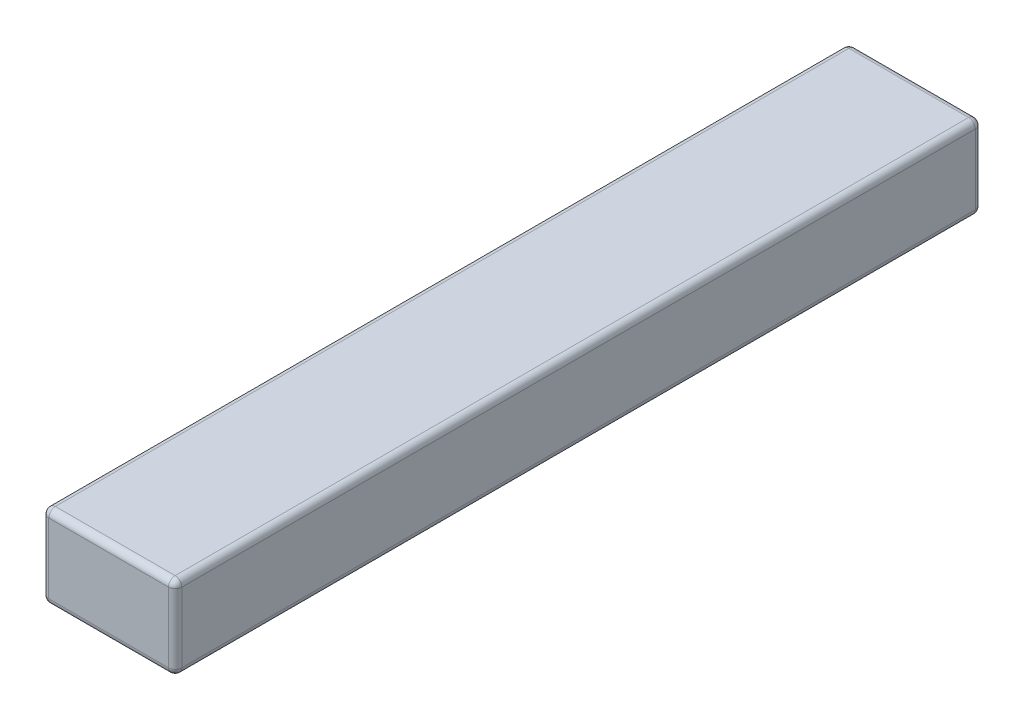
ISO-10303-21;
HEADER;
FILE_DESCRIPTION(('STEP AP214'),'2;1');
FILE_NAME('part.step','',(''),(''),'','','');
FILE_SCHEMA(('AUTOMOTIVE_DESIGN { 1 0 10303 214 1 1 1 1 }'));
ENDSEC;
DATA;
#1=APPLICATION_CONTEXT('core data for automotive mechanical design processes');
#2=APPLICATION_PROTOCOL_DEFINITION('international standard','automotive_design',2000,#1);
#3=PRODUCT_CONTEXT('',#1,'mechanical');
#4=PRODUCT('Part','Part','',(#3));
#5=PRODUCT_RELATED_PRODUCT_CATEGORY('part','',(#4));
#6=PRODUCT_DEFINITION_FORMATION('','',#4);
#7=PRODUCT_DEFINITION_CONTEXT('part definition',#1,'design');
#8=PRODUCT_DEFINITION('design','',#6,#7);
#9=PRODUCT_DEFINITION_SHAPE('','',#8);
#10=(LENGTH_UNIT() NAMED_UNIT(*) SI_UNIT(.MILLI.,.METRE.));
#11=(NAMED_UNIT(*) PLANE_ANGLE_UNIT() SI_UNIT($,.RADIAN.));
#12=(NAMED_UNIT(*) SI_UNIT($,.STERADIAN.) SOLID_ANGLE_UNIT());
#13=UNCERTAINTY_MEASURE_WITH_UNIT(LENGTH_MEASURE(1.E-05),#10,'distance_accuracy_value','');
#14=(GEOMETRIC_REPRESENTATION_CONTEXT(3) GLOBAL_UNCERTAINTY_ASSIGNED_CONTEXT((#13)) GLOBAL_UNIT_ASSIGNED_CONTEXT((#10,
#11,#12)) REPRESENTATION_CONTEXT('',''));
#15=CARTESIAN_POINT('',(0.,0.,0.));
#16=DIRECTION('',(0.,0.,1.));
#17=DIRECTION('',(1.,0.,0.));
#18=AXIS2_PLACEMENT_3D('',#15,#16,#17);
#19=CARTESIAN_POINT('',(0.,0.,485.));
#20=DIRECTION('',(1.,0.,0.));
#21=DIRECTION('',(0.,0.,-1.));
#22=AXIS2_PLACEMENT_3D('',#19,#20,#21);
#23=PLANE('',#22);
#24=DIRECTION('',(0.,-1.,0.));
#25=VECTOR('',#24,1.);
#26=CARTESIAN_POINT('',(0.,0.,4.));
#27=LINE('',#26,#25);
#28=CARTESIAN_POINT('',(0.,-4.,4.));
#29=VERTEX_POINT('',#28);
#30=CARTESIAN_POINT('',(0.,-46.,4.));
#31=VERTEX_POINT('',#30);
#32=EDGE_CURVE('E171',#29,#31,#27,.T.);
#33=ORIENTED_EDGE('',*,*,#32,.T.);
#34=DIRECTION('',(0.,0.,-1.));
#35=VECTOR('',#34,1.);
#36=CARTESIAN_POINT('',(0.,-46.,485.));
#37=LINE('',#36,#35);
#38=CARTESIAN_POINT('',(0.,-46.,481.));
#39=VERTEX_POINT('',#38);
#40=EDGE_CURVE('E176',#31,#39,#37,.F.);
#41=ORIENTED_EDGE('',*,*,#40,.T.);
#42=DIRECTION('',(0.,-1.,0.));
#43=VECTOR('',#42,1.);
#44=CARTESIAN_POINT('',(0.,0.,481.));
#45=LINE('',#44,#43);
#46=CARTESIAN_POINT('',(0.,-4.,481.));
#47=VERTEX_POINT('',#46);
#48=EDGE_CURVE('E173',#39,#47,#45,.F.);
#49=ORIENTED_EDGE('',*,*,#48,.T.);
#50=DIRECTION('',(0.,0.,-1.));
#51=VECTOR('',#50,1.);
#52=CARTESIAN_POINT('',(0.,-4.,485.));
#53=LINE('',#52,#51);
#54=EDGE_CURVE('E169',#47,#29,#53,.T.);
#55=ORIENTED_EDGE('',*,*,#54,.T.);
#56=EDGE_LOOP('',(#33,#41,#49,#55));
#57=FACE_BOUND('',#56,.T.);
#58=ADVANCED_FACE('F39',(#57),#23,.F.);
#59=CARTESIAN_POINT('',(0.,-50.,485.));
#60=DIRECTION('',(0.,1.,0.));
#61=DIRECTION('',(0.,0.,1.));
#62=AXIS2_PLACEMENT_3D('',#59,#60,#61);
#63=PLANE('',#62);
#64=DIRECTION('',(1.,0.,0.));
#65=VECTOR('',#64,1.);
#66=CARTESIAN_POINT('',(0.,-50.,481.));
#67=LINE('',#66,#65);
#68=CARTESIAN_POINT('',(76.,-50.,481.));
#69=VERTEX_POINT('',#68);
#70=CARTESIAN_POINT('',(4.,-50.,481.));
#71=VERTEX_POINT('',#70);
#72=EDGE_CURVE('E191',#69,#71,#67,.F.);
#73=ORIENTED_EDGE('',*,*,#72,.T.);
#74=DIRECTION('',(0.,0.,-1.));
#75=VECTOR('',#74,1.);
#76=CARTESIAN_POINT('',(4.,-50.,485.));
#77=LINE('',#76,#75);
#78=CARTESIAN_POINT('',(4.,-50.,4.));
#79=VERTEX_POINT('',#78);
#80=EDGE_CURVE('E193',#71,#79,#77,.T.);
#81=ORIENTED_EDGE('',*,*,#80,.T.);
#82=DIRECTION('',(1.,0.,0.));
#83=VECTOR('',#82,1.);
#84=CARTESIAN_POINT('',(0.,-50.,4.));
#85=LINE('',#84,#83);
#86=CARTESIAN_POINT('',(76.,-50.,4.));
#87=VERTEX_POINT('',#86);
#88=EDGE_CURVE('E189',#79,#87,#85,.T.);
#89=ORIENTED_EDGE('',*,*,#88,.T.);
#90=DIRECTION('',(0.,0.,-1.));
#91=VECTOR('',#90,1.);
#92=CARTESIAN_POINT('',(76.,-50.,485.));
#93=LINE('',#92,#91);
#94=EDGE_CURVE('E187',#87,#69,#93,.F.);
#95=ORIENTED_EDGE('',*,*,#94,.T.);
#96=EDGE_LOOP('',(#73,#81,#89,#95));
#97=FACE_BOUND('',#96,.T.);
#98=ADVANCED_FACE('F282',(#97),#63,.F.);
#99=CARTESIAN_POINT('',(80.,0.,485.));
#100=DIRECTION('',(-1.,0.,0.));
#101=DIRECTION('',(0.,0.,1.));
#102=AXIS2_PLACEMENT_3D('',#99,#100,#101);
#103=PLANE('',#102);
#104=DIRECTION('',(0.,1.,0.));
#105=VECTOR('',#104,1.);
#106=CARTESIAN_POINT('',(80.,-50.,481.));
#107=LINE('',#106,#105);
#108=CARTESIAN_POINT('',(80.,-4.,481.));
#109=VERTEX_POINT('',#108);
#110=CARTESIAN_POINT('',(80.,-46.,481.));
#111=VERTEX_POINT('',#110);
#112=EDGE_CURVE('E144',#109,#111,#107,.F.);
#113=ORIENTED_EDGE('',*,*,#112,.T.);
#114=DIRECTION('',(0.,0.,-1.));
#115=VECTOR('',#114,1.);
#116=CARTESIAN_POINT('',(80.,-46.,485.));
#117=LINE('',#116,#115);
#118=CARTESIAN_POINT('',(80.,-46.,4.));
#119=VERTEX_POINT('',#118);
#120=EDGE_CURVE('E201',#111,#119,#117,.T.);
#121=ORIENTED_EDGE('',*,*,#120,.T.);
#122=DIRECTION('',(0.,1.,0.));
#123=VECTOR('',#122,1.);
#124=CARTESIAN_POINT('',(80.,0.,4.));
#125=LINE('',#124,#123);
#126=CARTESIAN_POINT('',(80.,-4.,4.));
#127=VERTEX_POINT('',#126);
#128=EDGE_CURVE('E198',#119,#127,#125,.T.);
#129=ORIENTED_EDGE('',*,*,#128,.T.);
#130=DIRECTION('',(0.,0.,-1.));
#131=VECTOR('',#130,1.);
#132=CARTESIAN_POINT('',(80.,-4.,485.));
#133=LINE('',#132,#131);
#134=EDGE_CURVE('E196',#127,#109,#133,.F.);
#135=ORIENTED_EDGE('',*,*,#134,.T.);
#136=EDGE_LOOP('',(#113,#121,#129,#135));
#137=FACE_BOUND('',#136,.T.);
#138=ADVANCED_FACE('F269',(#137),#103,.F.);
#139=CARTESIAN_POINT('',(0.,0.,485.));
#140=DIRECTION('',(0.,-1.,0.));
#141=DIRECTION('',(0.,0.,-1.));
#142=AXIS2_PLACEMENT_3D('',#139,#140,#141);
#143=PLANE('',#142);
#144=DIRECTION('',(-1.,0.,0.));
#145=VECTOR('',#144,1.);
#146=CARTESIAN_POINT('',(80.,0.,481.));
#147=LINE('',#146,#145);
#148=CARTESIAN_POINT('',(4.,0.,481.));
#149=VERTEX_POINT('',#148);
#150=CARTESIAN_POINT('',(76.,0.,481.));
#151=VERTEX_POINT('',#150);
#152=EDGE_CURVE('E48',#149,#151,#147,.F.);
#153=ORIENTED_EDGE('',*,*,#152,.T.);
#154=DIRECTION('',(0.,0.,-1.));
#155=VECTOR('',#154,1.);
#156=CARTESIAN_POINT('',(76.,0.,485.));
#157=LINE('',#156,#155);
#158=CARTESIAN_POINT('',(76.,0.,4.));
#159=VERTEX_POINT('',#158);
#160=EDGE_CURVE('E11',#151,#159,#157,.T.);
#161=ORIENTED_EDGE('',*,*,#160,.T.);
#162=DIRECTION('',(-1.,0.,0.));
#163=VECTOR('',#162,1.);
#164=CARTESIAN_POINT('',(0.,0.,4.));
#165=LINE('',#164,#163);
#166=CARTESIAN_POINT('',(4.,0.,4.));
#167=VERTEX_POINT('',#166);
#168=EDGE_CURVE('E204',#159,#167,#165,.T.);
#169=ORIENTED_EDGE('',*,*,#168,.T.);
#170=DIRECTION('',(0.,0.,-1.));
#171=VECTOR('',#170,1.);
#172=CARTESIAN_POINT('',(4.,0.,485.));
#173=LINE('',#172,#171);
#174=EDGE_CURVE('E59',#167,#149,#173,.F.);
#175=ORIENTED_EDGE('',*,*,#174,.T.);
#176=EDGE_LOOP('',(#153,#161,#169,#175));
#177=FACE_BOUND('',#176,.T.);
#178=ADVANCED_FACE('F315',(#177),#143,.F.);
#179=CARTESIAN_POINT('',(0.,0.,485.));
#180=DIRECTION('',(0.,0.,1.));
#181=DIRECTION('',(1.,0.,0.));
#182=AXIS2_PLACEMENT_3D('',#179,#180,#181);
#183=PLANE('',#182);
#184=DIRECTION('',(-1.,0.,0.));
#185=VECTOR('',#184,1.);
#186=CARTESIAN_POINT('',(0.,-4.,485.));
#187=LINE('',#186,#185);
#188=CARTESIAN_POINT('',(76.,-4.,485.));
#189=VERTEX_POINT('',#188);
#190=CARTESIAN_POINT('',(4.,-4.,485.));
#191=VERTEX_POINT('',#190);
#192=EDGE_CURVE('E131',#189,#191,#187,.T.);
#193=ORIENTED_EDGE('',*,*,#192,.T.);
#194=DIRECTION('',(0.,-1.,0.));
#195=VECTOR('',#194,1.);
#196=CARTESIAN_POINT('',(4.,-50.,485.));
#197=LINE('',#196,#195);
#198=CARTESIAN_POINT('',(4.,-46.,485.));
#199=VERTEX_POINT('',#198);
#200=EDGE_CURVE('E167',#191,#199,#197,.T.);
#201=ORIENTED_EDGE('',*,*,#200,.T.);
#202=DIRECTION('',(1.,0.,0.));
#203=VECTOR('',#202,1.);
#204=CARTESIAN_POINT('',(80.,-46.,485.));
#205=LINE('',#204,#203);
#206=CARTESIAN_POINT('',(76.,-46.,485.));
#207=VERTEX_POINT('',#206);
#208=EDGE_CURVE('E134',#199,#207,#205,.T.);
#209=ORIENTED_EDGE('',*,*,#208,.T.);
#210=DIRECTION('',(0.,1.,0.));
#211=VECTOR('',#210,1.);
#212=CARTESIAN_POINT('',(76.,0.,485.));
#213=LINE('',#212,#211);
#214=EDGE_CURVE('E126',#207,#189,#213,.T.);
#215=ORIENTED_EDGE('',*,*,#214,.T.);
#216=EDGE_LOOP('',(#193,#201,#209,#215));
#217=FACE_BOUND('',#216,.T.);
#218=ADVANCED_FACE('F128',(#217),#183,.T.);
#219=CARTESIAN_POINT('',(0.,0.,0.));
#220=DIRECTION('',(0.,0.,1.));
#221=DIRECTION('',(1.,0.,0.));
#222=AXIS2_PLACEMENT_3D('',#219,#220,#221);
#223=PLANE('',#222);
#224=DIRECTION('',(1.,0.,0.));
#225=VECTOR('',#224,1.);
#226=CARTESIAN_POINT('',(0.,-46.,0.));
#227=LINE('',#226,#225);
#228=CARTESIAN_POINT('',(76.,-46.,0.));
#229=VERTEX_POINT('',#228);
#230=CARTESIAN_POINT('',(4.,-46.,0.));
#231=VERTEX_POINT('',#230);
#232=EDGE_CURVE('E182',#229,#231,#227,.F.);
#233=ORIENTED_EDGE('',*,*,#232,.T.);
#234=DIRECTION('',(0.,-1.,0.));
#235=VECTOR('',#234,1.);
#236=CARTESIAN_POINT('',(4.,0.,0.));
#237=LINE('',#236,#235);
#238=CARTESIAN_POINT('',(4.,-4.,0.));
#239=VERTEX_POINT('',#238);
#240=EDGE_CURVE('E184',#231,#239,#237,.F.);
#241=ORIENTED_EDGE('',*,*,#240,.T.);
#242=DIRECTION('',(-1.,0.,0.));
#243=VECTOR('',#242,1.);
#244=CARTESIAN_POINT('',(0.,-4.,0.));
#245=LINE('',#244,#243);
#246=CARTESIAN_POINT('',(76.,-4.,0.));
#247=VERTEX_POINT('',#246);
#248=EDGE_CURVE('E178',#239,#247,#245,.F.);
#249=ORIENTED_EDGE('',*,*,#248,.T.);
#250=DIRECTION('',(0.,1.,0.));
#251=VECTOR('',#250,1.);
#252=CARTESIAN_POINT('',(76.,0.,0.));
#253=LINE('',#252,#251);
#254=EDGE_CURVE('E180',#247,#229,#253,.F.);
#255=ORIENTED_EDGE('',*,*,#254,.T.);
#256=EDGE_LOOP('',(#233,#241,#249,#255));
#257=FACE_BOUND('',#256,.T.);
#258=ADVANCED_FACE('F298',(#257),#223,.F.);
#259=CARTESIAN_POINT('',(76.,0.,4.));
#260=DIRECTION('',(0.,1.,0.));
#261=DIRECTION('',(0.,0.,1.));
#262=AXIS2_PLACEMENT_3D('',#259,#260,#261);
#263=CYLINDRICAL_SURFACE('',#262,4.);
#264=CARTESIAN_POINT('',(76.,-4.,4.));
#265=DIRECTION('',(0.,1.,0.));
#266=DIRECTION('',(0.,0.,1.));
#267=AXIS2_PLACEMENT_3D('',#264,#265,#266);
#268=CIRCLE('',#267,4.);
#269=EDGE_CURVE('E43',#127,#247,#268,.T.);
#270=ORIENTED_EDGE('',*,*,#269,.F.);
#271=ORIENTED_EDGE('',*,*,#128,.F.);
#272=CARTESIAN_POINT('',(76.,-46.,4.));
#273=DIRECTION('',(0.,-1.,0.));
#274=DIRECTION('',(0.,0.,-1.));
#275=AXIS2_PLACEMENT_3D('',#272,#273,#274);
#276=CIRCLE('',#275,4.);
#277=EDGE_CURVE('E164',#229,#119,#276,.T.);
#278=ORIENTED_EDGE('',*,*,#277,.F.);
#279=ORIENTED_EDGE('',*,*,#254,.F.);
#280=EDGE_LOOP('',(#270,#271,#278,#279));
#281=FACE_BOUND('',#280,.T.);
#282=ADVANCED_FACE('F41',(#281),#263,.T.);
#283=CARTESIAN_POINT('',(76.,-4.,4.));
#284=DIRECTION('',(0.,0.,-1.));
#285=DIRECTION('',(-1.,0.,0.));
#286=AXIS2_PLACEMENT_3D('',#283,#284,#285);
#287=SPHERICAL_SURFACE('',#286,4.);
#288=CARTESIAN_POINT('',(76.,-4.,4.));
#289=DIRECTION('',(0.,0.,-1.));
#290=DIRECTION('',(-1.,0.,0.));
#291=AXIS2_PLACEMENT_3D('',#288,#289,#290);
#292=CIRCLE('',#291,4.);
#293=EDGE_CURVE('E249',#127,#159,#292,.F.);
#294=ORIENTED_EDGE('',*,*,#293,.F.);
#295=ORIENTED_EDGE('',*,*,#269,.T.);
#296=CARTESIAN_POINT('',(76.,-4.,4.));
#297=DIRECTION('',(1.,0.,0.));
#298=DIRECTION('',(0.,0.,-1.));
#299=AXIS2_PLACEMENT_3D('',#296,#297,#298);
#300=CIRCLE('',#299,4.);
#301=EDGE_CURVE('E252',#159,#247,#300,.F.);
#302=ORIENTED_EDGE('',*,*,#301,.F.);
#303=EDGE_LOOP('',(#294,#295,#302));
#304=FACE_BOUND('',#303,.T.);
#305=ADVANCED_FACE('F311',(#304),#287,.T.);
#306=CARTESIAN_POINT('',(76.,-46.,4.));
#307=DIRECTION('',(1.,0.,0.));
#308=DIRECTION('',(0.,0.,-1.));
#309=AXIS2_PLACEMENT_3D('',#306,#307,#308);
#310=SPHERICAL_SURFACE('',#309,4.);
#311=CARTESIAN_POINT('',(76.,-46.,4.));
#312=DIRECTION('',(1.,0.,0.));
#313=DIRECTION('',(0.,0.,-1.));
#314=AXIS2_PLACEMENT_3D('',#311,#312,#313);
#315=CIRCLE('',#314,4.);
#316=EDGE_CURVE('E244',#229,#87,#315,.F.);
#317=ORIENTED_EDGE('',*,*,#316,.F.);
#318=ORIENTED_EDGE('',*,*,#277,.T.);
#319=CARTESIAN_POINT('',(76.,-46.,4.));
#320=DIRECTION('',(0.,0.,-1.));
#321=DIRECTION('',(-1.,0.,0.));
#322=AXIS2_PLACEMENT_3D('',#319,#320,#321);
#323=CIRCLE('',#322,4.);
#324=EDGE_CURVE('E247',#87,#119,#323,.F.);
#325=ORIENTED_EDGE('',*,*,#324,.F.);
#326=EDGE_LOOP('',(#317,#318,#325));
#327=FACE_BOUND('',#326,.T.);
#328=ADVANCED_FACE('F260',(#327),#310,.T.);
#329=CARTESIAN_POINT('',(0.,-4.,4.));
#330=DIRECTION('',(-1.,0.,0.));
#331=DIRECTION('',(0.,0.,1.));
#332=AXIS2_PLACEMENT_3D('',#329,#330,#331);
#333=CYLINDRICAL_SURFACE('',#332,4.);
#334=ORIENTED_EDGE('',*,*,#301,.T.);
#335=ORIENTED_EDGE('',*,*,#248,.F.);
#336=CARTESIAN_POINT('',(4.,-4.,4.));
#337=DIRECTION('',(-1.,0.,0.));
#338=DIRECTION('',(0.,0.,1.));
#339=AXIS2_PLACEMENT_3D('',#336,#337,#338);
#340=CIRCLE('',#339,4.);
#341=EDGE_CURVE('E239',#167,#239,#340,.T.);
#342=ORIENTED_EDGE('',*,*,#341,.F.);
#343=ORIENTED_EDGE('',*,*,#168,.F.);
#344=EDGE_LOOP('',(#334,#335,#342,#343));
#345=FACE_BOUND('',#344,.T.);
#346=ADVANCED_FACE('F308',(#345),#333,.T.);
#347=CARTESIAN_POINT('',(76.,-4.,485.));
#348=DIRECTION('',(0.,0.,-1.));
#349=DIRECTION('',(-1.,0.,0.));
#350=AXIS2_PLACEMENT_3D('',#347,#348,#349);
#351=CYLINDRICAL_SURFACE('',#350,4.);
#352=ORIENTED_EDGE('',*,*,#293,.T.);
#353=ORIENTED_EDGE('',*,*,#160,.F.);
#354=CARTESIAN_POINT('',(76.,-4.,481.));
#355=DIRECTION('',(0.,0.,1.));
#356=DIRECTION('',(1.,0.,0.));
#357=AXIS2_PLACEMENT_3D('',#354,#355,#356);
#358=CIRCLE('',#357,4.);
#359=EDGE_CURVE('E148',#109,#151,#358,.T.);
#360=ORIENTED_EDGE('',*,*,#359,.F.);
#361=ORIENTED_EDGE('',*,*,#134,.F.);
#362=EDGE_LOOP('',(#352,#353,#360,#361));
#363=FACE_BOUND('',#362,.T.);
#364=ADVANCED_FACE('F314',(#363),#351,.T.);
#365=CARTESIAN_POINT('',(76.,0.,481.));
#366=DIRECTION('',(0.,-1.,0.));
#367=DIRECTION('',(0.,0.,-1.));
#368=AXIS2_PLACEMENT_3D('',#365,#366,#367);
#369=CYLINDRICAL_SURFACE('',#368,4.);
#370=CARTESIAN_POINT('',(76.,-46.,481.));
#371=DIRECTION('',(0.,-1.,0.));
#372=DIRECTION('',(0.,0.,-1.));
#373=AXIS2_PLACEMENT_3D('',#370,#371,#372);
#374=CIRCLE('',#373,4.);
#375=EDGE_CURVE('E149',#111,#207,#374,.T.);
#376=ORIENTED_EDGE('',*,*,#375,.F.);
#377=ORIENTED_EDGE('',*,*,#112,.F.);
#378=CARTESIAN_POINT('',(76.,-4.,481.));
#379=DIRECTION('',(0.,1.,0.));
#380=DIRECTION('',(0.,0.,1.));
#381=AXIS2_PLACEMENT_3D('',#378,#379,#380);
#382=CIRCLE('',#381,4.);
#383=EDGE_CURVE('E141',#189,#109,#382,.T.);
#384=ORIENTED_EDGE('',*,*,#383,.F.);
#385=ORIENTED_EDGE('',*,*,#214,.F.);
#386=EDGE_LOOP('',(#376,#377,#384,#385));
#387=FACE_BOUND('',#386,.T.);
#388=ADVANCED_FACE('F143',(#387),#369,.T.);
#389=CARTESIAN_POINT('',(76.,-46.,485.));
#390=DIRECTION('',(0.,0.,-1.));
#391=DIRECTION('',(-1.,0.,0.));
#392=AXIS2_PLACEMENT_3D('',#389,#390,#391);
#393=CYLINDRICAL_SURFACE('',#392,4.);
#394=ORIENTED_EDGE('',*,*,#324,.T.);
#395=ORIENTED_EDGE('',*,*,#120,.F.);
#396=CARTESIAN_POINT('',(76.,-46.,481.));
#397=DIRECTION('',(0.,0.,1.));
#398=DIRECTION('',(1.,0.,0.));
#399=AXIS2_PLACEMENT_3D('',#396,#397,#398);
#400=CIRCLE('',#399,4.);
#401=EDGE_CURVE('E234',#69,#111,#400,.T.);
#402=ORIENTED_EDGE('',*,*,#401,.F.);
#403=ORIENTED_EDGE('',*,*,#94,.F.);
#404=EDGE_LOOP('',(#394,#395,#402,#403));
#405=FACE_BOUND('',#404,.T.);
#406=ADVANCED_FACE('F272',(#405),#393,.T.);
#407=CARTESIAN_POINT('',(0.,-46.,4.));
#408=DIRECTION('',(1.,0.,0.));
#409=DIRECTION('',(0.,0.,-1.));
#410=AXIS2_PLACEMENT_3D('',#407,#408,#409);
#411=CYLINDRICAL_SURFACE('',#410,4.);
#412=ORIENTED_EDGE('',*,*,#316,.T.);
#413=ORIENTED_EDGE('',*,*,#88,.F.);
#414=CARTESIAN_POINT('',(4.,-46.,4.));
#415=DIRECTION('',(-1.,0.,0.));
#416=DIRECTION('',(0.,0.,1.));
#417=AXIS2_PLACEMENT_3D('',#414,#415,#416);
#418=CIRCLE('',#417,4.);
#419=EDGE_CURVE('E231',#231,#79,#418,.T.);
#420=ORIENTED_EDGE('',*,*,#419,.F.);
#421=ORIENTED_EDGE('',*,*,#232,.F.);
#422=EDGE_LOOP('',(#412,#413,#420,#421));
#423=FACE_BOUND('',#422,.T.);
#424=ADVANCED_FACE('F295',(#423),#411,.T.);
#425=CARTESIAN_POINT('',(4.,0.,4.));
#426=DIRECTION('',(0.,-1.,0.));
#427=DIRECTION('',(0.,0.,-1.));
#428=AXIS2_PLACEMENT_3D('',#425,#426,#427);
#429=CYLINDRICAL_SURFACE('',#428,4.);
#430=CARTESIAN_POINT('',(4.,-4.,4.));
#431=DIRECTION('',(0.,1.,0.));
#432=DIRECTION('',(0.,0.,1.));
#433=AXIS2_PLACEMENT_3D('',#430,#431,#432);
#434=CIRCLE('',#433,4.);
#435=EDGE_CURVE('E241',#239,#29,#434,.T.);
#436=ORIENTED_EDGE('',*,*,#435,.F.);
#437=ORIENTED_EDGE('',*,*,#240,.F.);
#438=CARTESIAN_POINT('',(4.,-46.,4.));
#439=DIRECTION('',(0.,-1.,0.));
#440=DIRECTION('',(0.,0.,-1.));
#441=AXIS2_PLACEMENT_3D('',#438,#439,#440);
#442=CIRCLE('',#441,4.);
#443=EDGE_CURVE('E228',#31,#231,#442,.T.);
#444=ORIENTED_EDGE('',*,*,#443,.F.);
#445=ORIENTED_EDGE('',*,*,#32,.F.);
#446=EDGE_LOOP('',(#436,#437,#444,#445));
#447=FACE_BOUND('',#446,.T.);
#448=ADVANCED_FACE('F301',(#447),#429,.T.);
#449=CARTESIAN_POINT('',(4.,-4.,4.));
#450=DIRECTION('',(0.,0.,-1.));
#451=DIRECTION('',(-1.,0.,0.));
#452=AXIS2_PLACEMENT_3D('',#449,#450,#451);
#453=SPHERICAL_SURFACE('',#452,4.);
#454=ORIENTED_EDGE('',*,*,#341,.T.);
#455=ORIENTED_EDGE('',*,*,#435,.T.);
#456=CARTESIAN_POINT('',(4.,-4.,4.));
#457=DIRECTION('',(0.,0.,-1.));
#458=DIRECTION('',(-1.,0.,0.));
#459=AXIS2_PLACEMENT_3D('',#456,#457,#458);
#460=CIRCLE('',#459,4.);
#461=EDGE_CURVE('E155',#167,#29,#460,.F.);
#462=ORIENTED_EDGE('',*,*,#461,.F.);
#463=EDGE_LOOP('',(#454,#455,#462));
#464=FACE_BOUND('',#463,.T.);
#465=ADVANCED_FACE('F361',(#464),#453,.T.);
#466=CARTESIAN_POINT('',(76.,-4.,481.));
#467=DIRECTION('',(1.,0.,0.));
#468=DIRECTION('',(0.,0.,-1.));
#469=AXIS2_PLACEMENT_3D('',#466,#467,#468);
#470=SPHERICAL_SURFACE('',#469,4.);
#471=ORIENTED_EDGE('',*,*,#383,.T.);
#472=ORIENTED_EDGE('',*,*,#359,.T.);
#473=CARTESIAN_POINT('',(76.,-4.,481.));
#474=DIRECTION('',(1.,0.,0.));
#475=DIRECTION('',(0.,0.,-1.));
#476=AXIS2_PLACEMENT_3D('',#473,#474,#475);
#477=CIRCLE('',#476,4.);
#478=EDGE_CURVE('E152',#189,#151,#477,.F.);
#479=ORIENTED_EDGE('',*,*,#478,.F.);
#480=EDGE_LOOP('',(#471,#472,#479));
#481=FACE_BOUND('',#480,.T.);
#482=ADVANCED_FACE('F153',(#481),#470,.T.);
#483=CARTESIAN_POINT('',(76.,-46.,481.));
#484=DIRECTION('',(1.,0.,0.));
#485=DIRECTION('',(0.,0.,-1.));
#486=AXIS2_PLACEMENT_3D('',#483,#484,#485);
#487=SPHERICAL_SURFACE('',#486,4.);
#488=ORIENTED_EDGE('',*,*,#401,.T.);
#489=ORIENTED_EDGE('',*,*,#375,.T.);
#490=CARTESIAN_POINT('',(76.,-46.,481.));
#491=DIRECTION('',(1.,0.,0.));
#492=DIRECTION('',(0.,0.,-1.));
#493=AXIS2_PLACEMENT_3D('',#490,#491,#492);
#494=CIRCLE('',#493,4.);
#495=EDGE_CURVE('E156',#69,#207,#494,.F.);
#496=ORIENTED_EDGE('',*,*,#495,.F.);
#497=EDGE_LOOP('',(#488,#489,#496));
#498=FACE_BOUND('',#497,.T.);
#499=ADVANCED_FACE('F275',(#498),#487,.T.);
#500=CARTESIAN_POINT('',(4.,-46.,4.));
#501=DIRECTION('',(0.,0.,-1.));
#502=DIRECTION('',(-1.,0.,0.));
#503=AXIS2_PLACEMENT_3D('',#500,#501,#502);
#504=SPHERICAL_SURFACE('',#503,4.);
#505=ORIENTED_EDGE('',*,*,#443,.T.);
#506=ORIENTED_EDGE('',*,*,#419,.T.);
#507=CARTESIAN_POINT('',(4.,-46.,4.));
#508=DIRECTION('',(0.,0.,-1.));
#509=DIRECTION('',(-1.,0.,0.));
#510=AXIS2_PLACEMENT_3D('',#507,#508,#509);
#511=CIRCLE('',#510,4.);
#512=EDGE_CURVE('E222',#31,#79,#511,.F.);
#513=ORIENTED_EDGE('',*,*,#512,.F.);
#514=EDGE_LOOP('',(#505,#506,#513));
#515=FACE_BOUND('',#514,.T.);
#516=ADVANCED_FACE('F292',(#515),#504,.T.);
#517=CARTESIAN_POINT('',(4.,-4.,485.));
#518=DIRECTION('',(0.,0.,-1.));
#519=DIRECTION('',(-1.,0.,0.));
#520=AXIS2_PLACEMENT_3D('',#517,#518,#519);
#521=CYLINDRICAL_SURFACE('',#520,4.);
#522=ORIENTED_EDGE('',*,*,#461,.T.);
#523=ORIENTED_EDGE('',*,*,#54,.F.);
#524=CARTESIAN_POINT('',(4.,-4.,481.));
#525=DIRECTION('',(0.,0.,1.));
#526=DIRECTION('',(1.,0.,0.));
#527=AXIS2_PLACEMENT_3D('',#524,#525,#526);
#528=CIRCLE('',#527,4.);
#529=EDGE_CURVE('E219',#149,#47,#528,.T.);
#530=ORIENTED_EDGE('',*,*,#529,.F.);
#531=ORIENTED_EDGE('',*,*,#174,.F.);
#532=EDGE_LOOP('',(#522,#523,#530,#531));
#533=FACE_BOUND('',#532,.T.);
#534=ADVANCED_FACE('F351',(#533),#521,.T.);
#535=CARTESIAN_POINT('',(0.,-4.,481.));
#536=DIRECTION('',(1.,0.,0.));
#537=DIRECTION('',(0.,0.,-1.));
#538=AXIS2_PLACEMENT_3D('',#535,#536,#537);
#539=CYLINDRICAL_SURFACE('',#538,4.);
#540=ORIENTED_EDGE('',*,*,#478,.T.);
#541=ORIENTED_EDGE('',*,*,#152,.F.);
#542=CARTESIAN_POINT('',(4.,-4.,481.));
#543=DIRECTION('',(-1.,0.,0.));
#544=DIRECTION('',(0.,0.,1.));
#545=AXIS2_PLACEMENT_3D('',#542,#543,#544);
#546=CIRCLE('',#545,4.);
#547=EDGE_CURVE('E160',#191,#149,#546,.T.);
#548=ORIENTED_EDGE('',*,*,#547,.F.);
#549=ORIENTED_EDGE('',*,*,#192,.F.);
#550=EDGE_LOOP('',(#540,#541,#548,#549));
#551=FACE_BOUND('',#550,.T.);
#552=ADVANCED_FACE('F158',(#551),#539,.T.);
#553=CARTESIAN_POINT('',(0.,-46.,481.));
#554=DIRECTION('',(-1.,0.,0.));
#555=DIRECTION('',(0.,0.,1.));
#556=AXIS2_PLACEMENT_3D('',#553,#554,#555);
#557=CYLINDRICAL_SURFACE('',#556,4.);
#558=ORIENTED_EDGE('',*,*,#495,.T.);
#559=ORIENTED_EDGE('',*,*,#208,.F.);
#560=CARTESIAN_POINT('',(4.,-46.,481.));
#561=DIRECTION('',(-1.,0.,0.));
#562=DIRECTION('',(0.,0.,1.));
#563=AXIS2_PLACEMENT_3D('',#560,#561,#562);
#564=CIRCLE('',#563,4.);
#565=EDGE_CURVE('E215',#71,#199,#564,.T.);
#566=ORIENTED_EDGE('',*,*,#565,.F.);
#567=ORIENTED_EDGE('',*,*,#72,.F.);
#568=EDGE_LOOP('',(#558,#559,#566,#567));
#569=FACE_BOUND('',#568,.T.);
#570=ADVANCED_FACE('F279',(#569),#557,.T.);
#571=CARTESIAN_POINT('',(4.,-46.,485.));
#572=DIRECTION('',(0.,0.,-1.));
#573=DIRECTION('',(-1.,0.,0.));
#574=AXIS2_PLACEMENT_3D('',#571,#572,#573);
#575=CYLINDRICAL_SURFACE('',#574,4.);
#576=ORIENTED_EDGE('',*,*,#512,.T.);
#577=ORIENTED_EDGE('',*,*,#80,.F.);
#578=CARTESIAN_POINT('',(4.,-46.,481.));
#579=DIRECTION('',(0.,0.,1.));
#580=DIRECTION('',(1.,0.,0.));
#581=AXIS2_PLACEMENT_3D('',#578,#579,#580);
#582=CIRCLE('',#581,4.);
#583=EDGE_CURVE('E212',#39,#71,#582,.T.);
#584=ORIENTED_EDGE('',*,*,#583,.F.);
#585=ORIENTED_EDGE('',*,*,#40,.F.);
#586=EDGE_LOOP('',(#576,#577,#584,#585));
#587=FACE_BOUND('',#586,.T.);
#588=ADVANCED_FACE('F285',(#587),#575,.T.);
#589=CARTESIAN_POINT('',(4.,-4.,481.));
#590=DIRECTION('',(0.,1.,0.));
#591=DIRECTION('',(0.,0.,1.));
#592=AXIS2_PLACEMENT_3D('',#589,#590,#591);
#593=SPHERICAL_SURFACE('',#592,4.);
#594=ORIENTED_EDGE('',*,*,#547,.T.);
#595=ORIENTED_EDGE('',*,*,#529,.T.);
#596=CARTESIAN_POINT('',(4.,-4.,481.));
#597=DIRECTION('',(0.,1.,0.));
#598=DIRECTION('',(0.,0.,1.));
#599=AXIS2_PLACEMENT_3D('',#596,#597,#598);
#600=CIRCLE('',#599,4.);
#601=EDGE_CURVE('E210',#191,#47,#600,.F.);
#602=ORIENTED_EDGE('',*,*,#601,.F.);
#603=EDGE_LOOP('',(#594,#595,#602));
#604=FACE_BOUND('',#603,.T.);
#605=ADVANCED_FACE('F340',(#604),#593,.T.);
#606=CARTESIAN_POINT('',(4.,-46.,481.));
#607=DIRECTION('',(0.,-1.,0.));
#608=DIRECTION('',(0.,0.,-1.));
#609=AXIS2_PLACEMENT_3D('',#606,#607,#608);
#610=SPHERICAL_SURFACE('',#609,4.);
#611=ORIENTED_EDGE('',*,*,#583,.T.);
#612=ORIENTED_EDGE('',*,*,#565,.T.);
#613=CARTESIAN_POINT('',(4.,-46.,481.));
#614=DIRECTION('',(0.,-1.,0.));
#615=DIRECTION('',(0.,0.,-1.));
#616=AXIS2_PLACEMENT_3D('',#613,#614,#615);
#617=CIRCLE('',#616,4.);
#618=EDGE_CURVE('E208',#39,#199,#617,.F.);
#619=ORIENTED_EDGE('',*,*,#618,.F.);
#620=EDGE_LOOP('',(#611,#612,#619));
#621=FACE_BOUND('',#620,.T.);
#622=ADVANCED_FACE('F336',(#621),#610,.T.);
#623=CARTESIAN_POINT('',(4.,0.,481.));
#624=DIRECTION('',(0.,1.,0.));
#625=DIRECTION('',(0.,0.,1.));
#626=AXIS2_PLACEMENT_3D('',#623,#624,#625);
#627=CYLINDRICAL_SURFACE('',#626,4.);
#628=ORIENTED_EDGE('',*,*,#601,.T.);
#629=ORIENTED_EDGE('',*,*,#48,.F.);
#630=ORIENTED_EDGE('',*,*,#618,.T.);
#631=ORIENTED_EDGE('',*,*,#200,.F.);
#632=EDGE_LOOP('',(#628,#629,#630,#631));
#633=FACE_BOUND('',#632,.T.);
#634=ADVANCED_FACE('F333',(#633),#627,.T.);
#635=CLOSED_SHELL('',(#58,#98,#138,#178,#218,#258,#282,#305,#328,#346,#364,#388,#406,#424,#448,
#465,#482,#499,#516,#534,#552,#570,#588,#605,#622,#634));
#636=MANIFOLD_SOLID_BREP('B2',#635);
#637=ADVANCED_BREP_SHAPE_REPRESENTATION('',(#18,#636),#14);
#638=SHAPE_DEFINITION_REPRESENTATION(#9,#637);
ENDSEC;
END-ISO-10303-21;
